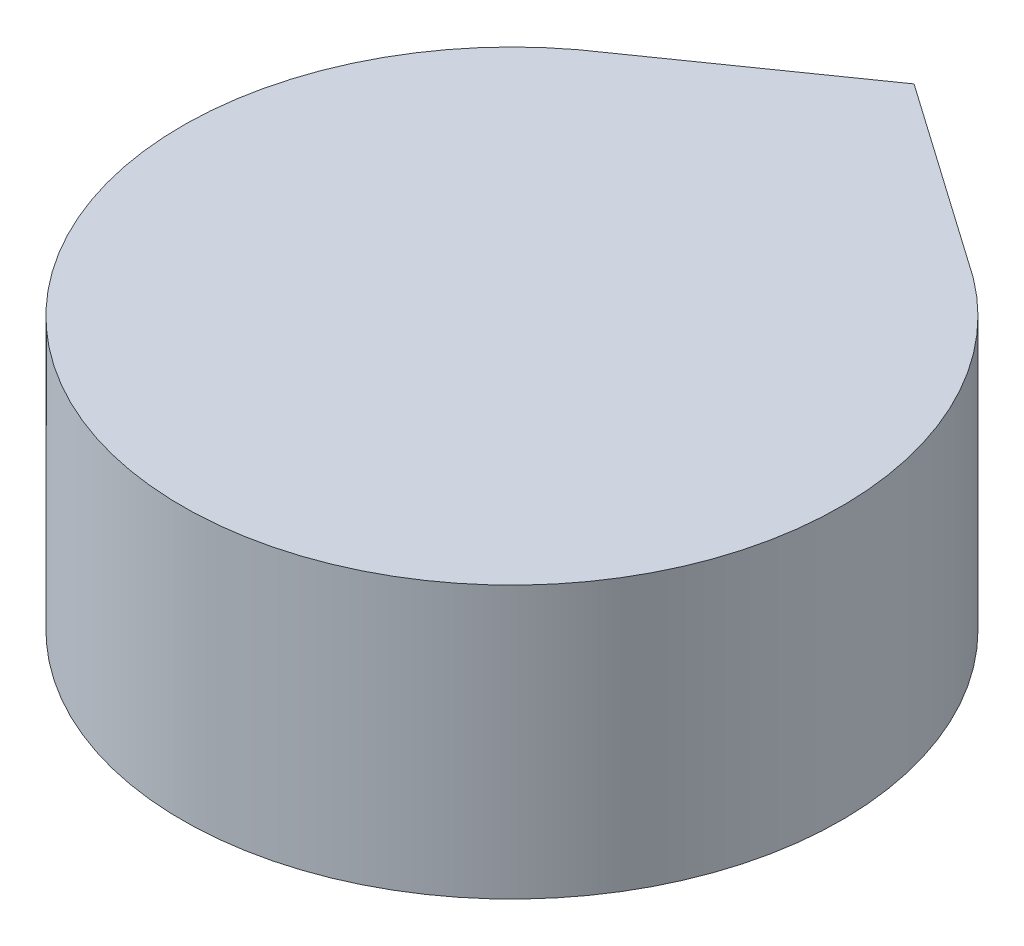
ISO-10303-21;
HEADER;
FILE_DESCRIPTION(('STEP AP214'),'2;1');
FILE_NAME('part.step','',(''),(''),'','','');
FILE_SCHEMA(('AUTOMOTIVE_DESIGN { 1 0 10303 214 1 1 1 1 }'));
ENDSEC;
DATA;
#1=APPLICATION_CONTEXT('core data for automotive mechanical design processes');
#2=APPLICATION_PROTOCOL_DEFINITION('international standard','automotive_design',2000,#1);
#3=PRODUCT_CONTEXT('',#1,'mechanical');
#4=PRODUCT('Part','Part','',(#3));
#5=PRODUCT_RELATED_PRODUCT_CATEGORY('part','',(#4));
#6=PRODUCT_DEFINITION_FORMATION('','',#4);
#7=PRODUCT_DEFINITION_CONTEXT('part definition',#1,'design');
#8=PRODUCT_DEFINITION('design','',#6,#7);
#9=PRODUCT_DEFINITION_SHAPE('','',#8);
#10=(LENGTH_UNIT() NAMED_UNIT(*) SI_UNIT(.MILLI.,.METRE.));
#11=(NAMED_UNIT(*) PLANE_ANGLE_UNIT() SI_UNIT($,.RADIAN.));
#12=(NAMED_UNIT(*) SI_UNIT($,.STERADIAN.) SOLID_ANGLE_UNIT());
#13=UNCERTAINTY_MEASURE_WITH_UNIT(LENGTH_MEASURE(1.E-05),#10,'distance_accuracy_value','');
#14=(GEOMETRIC_REPRESENTATION_CONTEXT(3) GLOBAL_UNCERTAINTY_ASSIGNED_CONTEXT((#13)) GLOBAL_UNIT_ASSIGNED_CONTEXT((#10,
#11,#12)) REPRESENTATION_CONTEXT('',''));
#15=CARTESIAN_POINT('',(0.,0.,0.));
#16=DIRECTION('',(0.,0.,1.));
#17=DIRECTION('',(1.,0.,0.));
#18=AXIS2_PLACEMENT_3D('',#15,#16,#17);
#19=CARTESIAN_POINT('',(0.,8.,0.));
#20=DIRECTION('',(0.,-1.,0.));
#21=DIRECTION('',(0.,0.,-1.));
#22=AXIS2_PLACEMENT_3D('',#19,#20,#21);
#23=CYLINDRICAL_SURFACE('',#22,10.);
#24=CARTESIAN_POINT('',(0.,8.25,0.));
#25=DIRECTION('',(0.,1.,0.));
#26=DIRECTION('',(0.,0.,1.));
#27=AXIS2_PLACEMENT_3D('',#24,#25,#26);
#28=CIRCLE('',#27,10.);
#29=CARTESIAN_POINT('',(-6.,8.25,-8.));
#30=VERTEX_POINT('',#29);
#31=CARTESIAN_POINT('',(6.,8.25,-8.));
#32=VERTEX_POINT('',#31);
#33=EDGE_CURVE('E115',#30,#32,#28,.T.);
#34=ORIENTED_EDGE('',*,*,#33,.F.);
#35=DIRECTION('',(0.,-1.,0.));
#36=VECTOR('',#35,1.);
#37=CARTESIAN_POINT('',(-6.,0.,-8.));
#38=LINE('',#37,#36);
#39=CARTESIAN_POINT('',(-6.,0.,-8.));
#40=VERTEX_POINT('',#39);
#41=EDGE_CURVE('E119',#40,#30,#38,.F.);
#42=ORIENTED_EDGE('',*,*,#41,.F.);
#43=CARTESIAN_POINT('',(0.,0.,0.));
#44=DIRECTION('',(0.,1.,0.));
#45=DIRECTION('',(0.,0.,1.));
#46=AXIS2_PLACEMENT_3D('',#43,#44,#45);
#47=CIRCLE('',#46,10.);
#48=CARTESIAN_POINT('',(6.,0.,-8.));
#49=VERTEX_POINT('',#48);
#50=EDGE_CURVE('E116',#40,#49,#47,.T.);
#51=ORIENTED_EDGE('',*,*,#50,.T.);
#52=DIRECTION('',(0.,-1.,0.));
#53=VECTOR('',#52,1.);
#54=CARTESIAN_POINT('',(6.,0.,-8.));
#55=LINE('',#54,#53);
#56=EDGE_CURVE('E124',#49,#32,#55,.F.);
#57=ORIENTED_EDGE('',*,*,#56,.T.);
#58=EDGE_LOOP('',(#34,#42,#51,#57));
#59=FACE_BOUND('',#58,.T.);
#60=ADVANCED_FACE('F41',(#59),#23,.T.);
#61=CARTESIAN_POINT('',(0.,0.,0.));
#62=DIRECTION('',(0.,1.,0.));
#63=DIRECTION('',(0.,0.,1.));
#64=AXIS2_PLACEMENT_3D('',#61,#62,#63);
#65=PLANE('',#64);
#66=DIRECTION('',(1.,0.,0.));
#67=VECTOR('',#66,1.);
#68=CARTESIAN_POINT('',(0.,0.,-1.25));
#69=LINE('',#68,#67);
#70=CARTESIAN_POINT('',(-3.,0.,-1.25));
#71=VERTEX_POINT('',#70);
#72=CARTESIAN_POINT('',(3.,0.,-1.25));
#73=VERTEX_POINT('',#72);
#74=EDGE_CURVE('E281',#71,#73,#69,.T.);
#75=ORIENTED_EDGE('',*,*,#74,.F.);
#76=CARTESIAN_POINT('',(0.,0.,0.));
#77=DIRECTION('',(0.,1.,0.));
#78=DIRECTION('',(0.,0.,1.));
#79=AXIS2_PLACEMENT_3D('',#76,#77,#78);
#80=CIRCLE('',#79,3.25);
#81=EDGE_CURVE('E134',#71,#73,#80,.T.);
#82=ORIENTED_EDGE('',*,*,#81,.T.);
#83=EDGE_LOOP('',(#75,#82));
#84=FACE_BOUND('',#83,.T.);
#85=DIRECTION('',(0.819152044288991,0.,-0.573576436351047));
#86=VECTOR('',#85,1.);
#87=CARTESIAN_POINT('',(2.56888804045269,0.,-14.));
#88=LINE('',#87,#86);
#89=CARTESIAN_POINT('',(0.,0.,-12.2012452292582));
#90=VERTEX_POINT('',#89);
#91=EDGE_CURVE('E114',#40,#90,#88,.T.);
#92=ORIENTED_EDGE('',*,*,#91,.T.);
#93=DIRECTION('',(0.819152044288994,0.,0.573576436351042));
#94=VECTOR('',#93,1.);
#95=CARTESIAN_POINT('',(-2.56888804045285,0.,-14.));
#96=LINE('',#95,#94);
#97=EDGE_CURVE('E49',#90,#49,#96,.T.);
#98=ORIENTED_EDGE('',*,*,#97,.T.);
#99=ORIENTED_EDGE('',*,*,#50,.F.);
#100=EDGE_LOOP('',(#92,#98,#99));
#101=FACE_BOUND('',#100,.T.);
#102=ADVANCED_FACE('F139',(#84,#101),#65,.F.);
#103=CARTESIAN_POINT('',(0.,8.,0.));
#104=DIRECTION('',(0.,1.,0.));
#105=DIRECTION('',(0.,0.,1.));
#106=AXIS2_PLACEMENT_3D('',#103,#104,#105);
#107=PLANE('',#106);
#108=DIRECTION('',(0.,0.,1.));
#109=VECTOR('',#108,1.);
#110=CARTESIAN_POINT('',(-0.75,8.,-1.25));
#111=LINE('',#110,#109);
#112=CARTESIAN_POINT('',(-0.75,8.,-1.25));
#113=VERTEX_POINT('',#112);
#114=CARTESIAN_POINT('',(-0.75,8.,3.16227766016838));
#115=VERTEX_POINT('',#114);
#116=EDGE_CURVE('E121',#113,#115,#111,.T.);
#117=ORIENTED_EDGE('',*,*,#116,.T.);
#118=CARTESIAN_POINT('',(0.,8.,0.));
#119=DIRECTION('',(0.,1.,0.));
#120=DIRECTION('',(0.,0.,1.));
#121=AXIS2_PLACEMENT_3D('',#118,#119,#120);
#122=CIRCLE('',#121,3.25);
#123=CARTESIAN_POINT('',(-3.,8.,-1.25));
#124=VERTEX_POINT('',#123);
#125=EDGE_CURVE('E261',#124,#115,#122,.T.);
#126=ORIENTED_EDGE('',*,*,#125,.F.);
#127=DIRECTION('',(1.,0.,0.));
#128=VECTOR('',#127,1.);
#129=CARTESIAN_POINT('',(0.,8.,-1.25));
#130=LINE('',#129,#128);
#131=EDGE_CURVE('E267',#124,#113,#130,.T.);
#132=ORIENTED_EDGE('',*,*,#131,.T.);
#133=EDGE_LOOP('',(#117,#126,#132));
#134=FACE_BOUND('',#133,.T.);
#135=ADVANCED_FACE('F149',(#134),#107,.F.);
#136=CARTESIAN_POINT('',(0.,8.,0.));
#137=DIRECTION('',(0.,-1.,0.));
#138=DIRECTION('',(0.,0.,-1.));
#139=AXIS2_PLACEMENT_3D('',#136,#137,#138);
#140=CYLINDRICAL_SURFACE('',#139,3.25);
#141=CARTESIAN_POINT('',(0.,6.,0.));
#142=DIRECTION('',(0.,1.,0.));
#143=DIRECTION('',(0.,0.,1.));
#144=AXIS2_PLACEMENT_3D('',#141,#142,#143);
#145=CIRCLE('',#144,3.25);
#146=CARTESIAN_POINT('',(-0.75,6.,3.16227766016838));
#147=VERTEX_POINT('',#146);
#148=CARTESIAN_POINT('',(0.75,6.,3.16227766016838));
#149=VERTEX_POINT('',#148);
#150=EDGE_CURVE('E292',#147,#149,#145,.T.);
#151=ORIENTED_EDGE('',*,*,#150,.T.);
#152=DIRECTION('',(0.,-1.,0.));
#153=VECTOR('',#152,1.);
#154=CARTESIAN_POINT('',(0.75,8.,3.16227766016838));
#155=LINE('',#154,#153);
#156=CARTESIAN_POINT('',(0.75,8.,3.16227766016838));
#157=VERTEX_POINT('',#156);
#158=EDGE_CURVE('E273',#157,#149,#155,.T.);
#159=ORIENTED_EDGE('',*,*,#158,.F.);
#160=CARTESIAN_POINT('',(3.,8.,-1.25));
#161=VERTEX_POINT('',#160);
#162=EDGE_CURVE('E278',#157,#161,#122,.T.);
#163=ORIENTED_EDGE('',*,*,#162,.T.);
#164=DIRECTION('',(0.,1.,0.));
#165=VECTOR('',#164,1.);
#166=CARTESIAN_POINT('',(3.,0.,-1.25));
#167=LINE('',#166,#165);
#168=EDGE_CURVE('E284',#73,#161,#167,.T.);
#169=ORIENTED_EDGE('',*,*,#168,.F.);
#170=ORIENTED_EDGE('',*,*,#81,.F.);
#171=DIRECTION('',(0.,1.,0.));
#172=VECTOR('',#171,1.);
#173=CARTESIAN_POINT('',(-3.,0.,-1.25));
#174=LINE('',#173,#172);
#175=EDGE_CURVE('E277',#71,#124,#174,.T.);
#176=ORIENTED_EDGE('',*,*,#175,.T.);
#177=ORIENTED_EDGE('',*,*,#125,.T.);
#178=DIRECTION('',(0.,-1.,0.));
#179=VECTOR('',#178,1.);
#180=CARTESIAN_POINT('',(-0.75,8.,3.16227766016838));
#181=LINE('',#180,#179);
#182=EDGE_CURVE('E275',#147,#115,#181,.F.);
#183=ORIENTED_EDGE('',*,*,#182,.F.);
#184=EDGE_LOOP('',(#151,#159,#163,#169,#170,#176,#177,#183));
#185=FACE_BOUND('',#184,.T.);
#186=ADVANCED_FACE('F158',(#185),#140,.F.);
#187=DIRECTION('',(0.,0.,-1.));
#188=VECTOR('',#187,1.);
#189=CARTESIAN_POINT('',(0.75,8.,-1.25));
#190=LINE('',#189,#188);
#191=CARTESIAN_POINT('',(0.75,8.,-1.25));
#192=VERTEX_POINT('',#191);
#193=EDGE_CURVE('E128',#157,#192,#190,.T.);
#194=ORIENTED_EDGE('',*,*,#193,.T.);
#195=EDGE_CURVE('E274',#192,#161,#130,.T.);
#196=ORIENTED_EDGE('',*,*,#195,.T.);
#197=ORIENTED_EDGE('',*,*,#162,.F.);
#198=EDGE_LOOP('',(#194,#196,#197));
#199=FACE_BOUND('',#198,.T.);
#200=ADVANCED_FACE('F162',(#199),#107,.F.);
#201=CARTESIAN_POINT('',(0.,0.,-1.25));
#202=DIRECTION('',(0.,0.,1.));
#203=DIRECTION('',(1.,0.,0.));
#204=AXIS2_PLACEMENT_3D('',#201,#202,#203);
#205=PLANE('',#204);
#206=DIRECTION('',(-1.,0.,0.));
#207=VECTOR('',#206,1.);
#208=CARTESIAN_POINT('',(-0.75,6.,-1.25));
#209=LINE('',#208,#207);
#210=CARTESIAN_POINT('',(0.75,6.,-1.25));
#211=VERTEX_POINT('',#210);
#212=CARTESIAN_POINT('',(-0.75,6.,-1.25));
#213=VERTEX_POINT('',#212);
#214=EDGE_CURVE('E296',#211,#213,#209,.T.);
#215=ORIENTED_EDGE('',*,*,#214,.T.);
#216=DIRECTION('',(0.,1.,0.));
#217=VECTOR('',#216,1.);
#218=CARTESIAN_POINT('',(-0.75,6.,-1.25));
#219=LINE('',#218,#217);
#220=EDGE_CURVE('E295',#213,#113,#219,.T.);
#221=ORIENTED_EDGE('',*,*,#220,.T.);
#222=ORIENTED_EDGE('',*,*,#131,.F.);
#223=ORIENTED_EDGE('',*,*,#175,.F.);
#224=ORIENTED_EDGE('',*,*,#74,.T.);
#225=ORIENTED_EDGE('',*,*,#168,.T.);
#226=ORIENTED_EDGE('',*,*,#195,.F.);
#227=DIRECTION('',(0.,1.,0.));
#228=VECTOR('',#227,1.);
#229=CARTESIAN_POINT('',(0.75,6.,-1.25));
#230=LINE('',#229,#228);
#231=EDGE_CURVE('E294',#211,#192,#230,.T.);
#232=ORIENTED_EDGE('',*,*,#231,.F.);
#233=EDGE_LOOP('',(#215,#221,#222,#223,#224,#225,#226,#232));
#234=FACE_BOUND('',#233,.T.);
#235=ADVANCED_FACE('F168',(#234),#205,.T.);
#236=CARTESIAN_POINT('',(-0.75,6.,-1.25));
#237=DIRECTION('',(-1.,0.,0.));
#238=DIRECTION('',(0.,0.,1.));
#239=AXIS2_PLACEMENT_3D('',#236,#237,#238);
#240=PLANE('',#239);
#241=DIRECTION('',(0.,0.,1.));
#242=VECTOR('',#241,1.);
#243=CARTESIAN_POINT('',(-0.75,6.,-1.25));
#244=LINE('',#243,#242);
#245=EDGE_CURVE('E268',#213,#147,#244,.T.);
#246=ORIENTED_EDGE('',*,*,#245,.T.);
#247=ORIENTED_EDGE('',*,*,#182,.T.);
#248=ORIENTED_EDGE('',*,*,#116,.F.);
#249=ORIENTED_EDGE('',*,*,#220,.F.);
#250=EDGE_LOOP('',(#246,#247,#248,#249));
#251=FACE_BOUND('',#250,.T.);
#252=ADVANCED_FACE('F167',(#251),#240,.T.);
#253=CARTESIAN_POINT('',(0.75,6.,-1.25));
#254=DIRECTION('',(1.,0.,0.));
#255=DIRECTION('',(0.,0.,-1.));
#256=AXIS2_PLACEMENT_3D('',#253,#254,#255);
#257=PLANE('',#256);
#258=ORIENTED_EDGE('',*,*,#193,.F.);
#259=ORIENTED_EDGE('',*,*,#158,.T.);
#260=DIRECTION('',(0.,0.,-1.));
#261=VECTOR('',#260,1.);
#262=CARTESIAN_POINT('',(0.75,6.,-1.25));
#263=LINE('',#262,#261);
#264=EDGE_CURVE('E305',#149,#211,#263,.T.);
#265=ORIENTED_EDGE('',*,*,#264,.T.);
#266=ORIENTED_EDGE('',*,*,#231,.T.);
#267=EDGE_LOOP('',(#258,#259,#265,#266));
#268=FACE_BOUND('',#267,.T.);
#269=ADVANCED_FACE('F172',(#268),#257,.T.);
#270=CARTESIAN_POINT('',(0.,6.,0.));
#271=DIRECTION('',(0.,1.,0.));
#272=DIRECTION('',(0.,0.,1.));
#273=AXIS2_PLACEMENT_3D('',#270,#271,#272);
#274=PLANE('',#273);
#275=ORIENTED_EDGE('',*,*,#150,.F.);
#276=ORIENTED_EDGE('',*,*,#245,.F.);
#277=ORIENTED_EDGE('',*,*,#214,.F.);
#278=ORIENTED_EDGE('',*,*,#264,.F.);
#279=EDGE_LOOP('',(#275,#276,#277,#278));
#280=FACE_BOUND('',#279,.T.);
#281=ADVANCED_FACE('F178',(#280),#274,.F.);
#282=CARTESIAN_POINT('',(0.,8.25,0.));
#283=DIRECTION('',(0.,1.,0.));
#284=DIRECTION('',(0.,0.,1.));
#285=AXIS2_PLACEMENT_3D('',#282,#283,#284);
#286=PLANE('',#285);
#287=ORIENTED_EDGE('',*,*,#33,.T.);
#288=DIRECTION('',(-0.819152044288994,0.,-0.573576436351042));
#289=VECTOR('',#288,1.);
#290=CARTESIAN_POINT('',(5.73271005316656,8.25,-8.18715843566038));
#291=LINE('',#290,#289);
#292=CARTESIAN_POINT('',(0.,8.25,-12.2012452292582));
#293=VERTEX_POINT('',#292);
#294=EDGE_CURVE('E11',#32,#293,#291,.T.);
#295=ORIENTED_EDGE('',*,*,#294,.T.);
#296=DIRECTION('',(-0.819152044288991,0.,0.573576436351047));
#297=VECTOR('',#296,1.);
#298=CARTESIAN_POINT('',(-5.73271005316663,8.25,-8.18715843566038));
#299=LINE('',#298,#297);
#300=EDGE_CURVE('E107',#293,#30,#299,.T.);
#301=ORIENTED_EDGE('',*,*,#300,.T.);
#302=EDGE_LOOP('',(#287,#295,#301));
#303=FACE_BOUND('',#302,.T.);
#304=ADVANCED_FACE('F111',(#303),#286,.T.);
#305=CARTESIAN_POINT('',(2.56888804045269,0.,-14.));
#306=DIRECTION('',(-0.573576436351047,0.,-0.819152044288991));
#307=DIRECTION('',(0.,-1.,0.));
#308=AXIS2_PLACEMENT_3D('',#305,#306,#307);
#309=PLANE('',#308);
#310=ORIENTED_EDGE('',*,*,#300,.F.);
#311=DIRECTION('',(0.,-1.,0.));
#312=VECTOR('',#311,1.);
#313=CARTESIAN_POINT('',(0.,0.,-12.2012452292582));
#314=LINE('',#313,#312);
#315=EDGE_CURVE('E65',#293,#90,#314,.T.);
#316=ORIENTED_EDGE('',*,*,#315,.T.);
#317=ORIENTED_EDGE('',*,*,#91,.F.);
#318=ORIENTED_EDGE('',*,*,#41,.T.);
#319=EDGE_LOOP('',(#310,#316,#317,#318));
#320=FACE_BOUND('',#319,.T.);
#321=ADVANCED_FACE('F126',(#320),#309,.T.);
#322=CARTESIAN_POINT('',(-2.56888804045285,0.,-14.));
#323=DIRECTION('',(0.573576436351042,0.,-0.819152044288994));
#324=DIRECTION('',(0.,1.,0.));
#325=AXIS2_PLACEMENT_3D('',#322,#323,#324);
#326=PLANE('',#325);
#327=ORIENTED_EDGE('',*,*,#294,.F.);
#328=ORIENTED_EDGE('',*,*,#56,.F.);
#329=ORIENTED_EDGE('',*,*,#97,.F.);
#330=ORIENTED_EDGE('',*,*,#315,.F.);
#331=EDGE_LOOP('',(#327,#328,#329,#330));
#332=FACE_BOUND('',#331,.T.);
#333=ADVANCED_FACE('F42',(#332),#326,.T.);
#334=CLOSED_SHELL('',(#60,#102,#135,#186,#200,#235,#252,#269,#281,#304,#321,#333));
#335=MANIFOLD_SOLID_BREP('B2',#334);
#336=ADVANCED_BREP_SHAPE_REPRESENTATION('',(#18,#335),#14);
#337=SHAPE_DEFINITION_REPRESENTATION(#9,#336);
ENDSEC;
END-ISO-10303-21;
